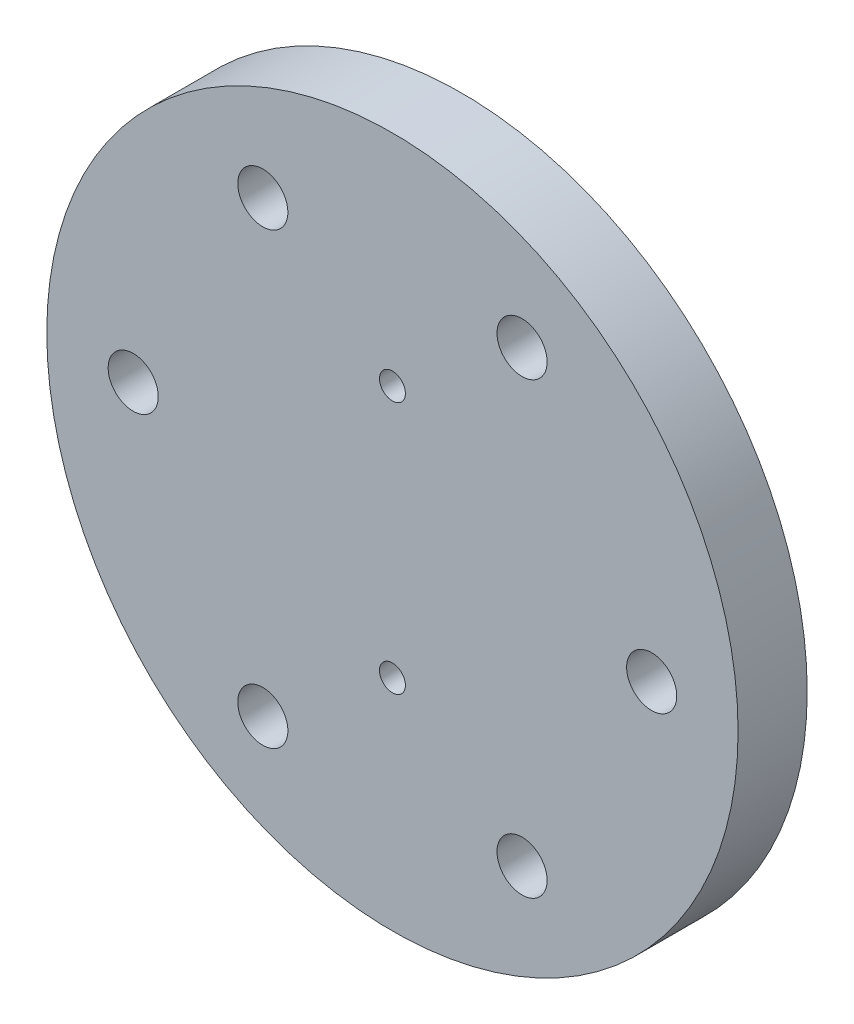
ISO-10303-21;
HEADER;
FILE_DESCRIPTION(('STEP AP214'),'2;1');
FILE_NAME('part.step','',(''),(''),'','','');
FILE_SCHEMA(('AUTOMOTIVE_DESIGN { 1 0 10303 214 1 1 1 1 }'));
ENDSEC;
DATA;
#1=APPLICATION_CONTEXT('core data for automotive mechanical design processes');
#2=APPLICATION_PROTOCOL_DEFINITION('international standard','automotive_design',2000,#1);
#3=PRODUCT_CONTEXT('',#1,'mechanical');
#4=PRODUCT('Part','Part','',(#3));
#5=PRODUCT_RELATED_PRODUCT_CATEGORY('part','',(#4));
#6=PRODUCT_DEFINITION_FORMATION('','',#4);
#7=PRODUCT_DEFINITION_CONTEXT('part definition',#1,'design');
#8=PRODUCT_DEFINITION('design','',#6,#7);
#9=PRODUCT_DEFINITION_SHAPE('','',#8);
#10=(LENGTH_UNIT() NAMED_UNIT(*) SI_UNIT(.MILLI.,.METRE.));
#11=(NAMED_UNIT(*) PLANE_ANGLE_UNIT() SI_UNIT($,.RADIAN.));
#12=(NAMED_UNIT(*) SI_UNIT($,.STERADIAN.) SOLID_ANGLE_UNIT());
#13=UNCERTAINTY_MEASURE_WITH_UNIT(LENGTH_MEASURE(1.E-05),#10,'distance_accuracy_value','');
#14=(GEOMETRIC_REPRESENTATION_CONTEXT(3) GLOBAL_UNCERTAINTY_ASSIGNED_CONTEXT((#13)) GLOBAL_UNIT_ASSIGNED_CONTEXT((#10,
#11,#12)) REPRESENTATION_CONTEXT('',''));
#15=CARTESIAN_POINT('',(0.,0.,0.));
#16=DIRECTION('',(0.,0.,1.));
#17=DIRECTION('',(1.,0.,0.));
#18=AXIS2_PLACEMENT_3D('',#15,#16,#17);
#19=CARTESIAN_POINT('',(0.,0.,8.));
#20=DIRECTION('',(0.,0.,-1.));
#21=DIRECTION('',(-1.,0.,0.));
#22=AXIS2_PLACEMENT_3D('',#19,#20,#21);
#23=PLANE('',#22);
#24=CARTESIAN_POINT('',(-60.0000000000006,14.6254466051496,8.));
#25=DIRECTION('',(0.,0.,-1.));
#26=DIRECTION('',(-1.,0.,0.));
#27=AXIS2_PLACEMENT_3D('',#24,#25,#26);
#28=CIRCLE('',#27,1.50000000000008);
#29=CARTESIAN_POINT('',(-61.5000000000007,14.6254466051496,8.));
#30=VERTEX_POINT('',#29);
#31=EDGE_CURVE('E82',#30,#30,#28,.T.);
#32=ORIENTED_EDGE('',*,*,#31,.T.);
#33=EDGE_LOOP('',(#32));
#34=FACE_BOUND('',#33,.T.);
#35=CARTESIAN_POINT('',(-60.0000000000006,-14.6245541914156,8.));
#36=DIRECTION('',(0.,0.,-1.));
#37=DIRECTION('',(-1.,0.,0.));
#38=AXIS2_PLACEMENT_3D('',#35,#36,#37);
#39=CIRCLE('',#38,1.50000000000008);
#40=CARTESIAN_POINT('',(-61.5000000000007,-14.6245541914156,8.));
#41=VERTEX_POINT('',#40);
#42=EDGE_CURVE('E85',#41,#41,#39,.T.);
#43=ORIENTED_EDGE('',*,*,#42,.T.);
#44=EDGE_LOOP('',(#43));
#45=FACE_BOUND('',#44,.T.);
#46=CARTESIAN_POINT('',(-74.9999999999989,25.9807621135329,8.));
#47=DIRECTION('',(0.,0.,-1.));
#48=DIRECTION('',(-1.,0.,0.));
#49=AXIS2_PLACEMENT_3D('',#46,#47,#48);
#50=CIRCLE('',#49,2.89999999999999);
#51=CARTESIAN_POINT('',(-77.8999999999989,25.9807621135329,8.));
#52=VERTEX_POINT('',#51);
#53=EDGE_CURVE('E76',#52,#52,#50,.T.);
#54=ORIENTED_EDGE('',*,*,#53,.T.);
#55=EDGE_LOOP('',(#54));
#56=FACE_BOUND('',#55,.T.);
#57=CARTESIAN_POINT('',(-44.9999999999988,25.9807621135322,8.));
#58=DIRECTION('',(0.,0.,-1.));
#59=DIRECTION('',(-1.,0.,0.));
#60=AXIS2_PLACEMENT_3D('',#57,#58,#59);
#61=CIRCLE('',#60,2.89999999999999);
#62=CARTESIAN_POINT('',(-47.8999999999987,25.9807621135322,8.));
#63=VERTEX_POINT('',#62);
#64=EDGE_CURVE('E70',#63,#63,#61,.T.);
#65=ORIENTED_EDGE('',*,*,#64,.T.);
#66=EDGE_LOOP('',(#65));
#67=FACE_BOUND('',#66,.T.);
#68=CARTESIAN_POINT('',(-29.9999999999994,-1.2784765609918E-12,8.));
#69=DIRECTION('',(0.,0.,-1.));
#70=DIRECTION('',(-1.,0.,0.));
#71=AXIS2_PLACEMENT_3D('',#68,#69,#70);
#72=CIRCLE('',#71,2.89999999999999);
#73=CARTESIAN_POINT('',(-32.8999999999994,-1.2784765609918E-12,8.));
#74=VERTEX_POINT('',#73);
#75=EDGE_CURVE('E64',#74,#74,#72,.T.);
#76=ORIENTED_EDGE('',*,*,#75,.T.);
#77=EDGE_LOOP('',(#76));
#78=FACE_BOUND('',#77,.T.);
#79=CARTESIAN_POINT('',(-45.,-25.9807621135342,8.));
#80=DIRECTION('',(0.,0.,-1.));
#81=DIRECTION('',(-1.,0.,0.));
#82=AXIS2_PLACEMENT_3D('',#79,#80,#81);
#83=CIRCLE('',#82,2.89999999999999);
#84=CARTESIAN_POINT('',(-47.9,-25.9807621135342,8.));
#85=VERTEX_POINT('',#84);
#86=EDGE_CURVE('E58',#85,#85,#83,.T.);
#87=ORIENTED_EDGE('',*,*,#86,.T.);
#88=EDGE_LOOP('',(#87));
#89=FACE_BOUND('',#88,.T.);
#90=CARTESIAN_POINT('',(-75.0000000000001,-25.9807621135335,8.));
#91=DIRECTION('',(0.,0.,-1.));
#92=DIRECTION('',(-1.,0.,0.));
#93=AXIS2_PLACEMENT_3D('',#90,#91,#92);
#94=CIRCLE('',#93,2.89999999999999);
#95=CARTESIAN_POINT('',(-77.9000000000001,-25.9807621135335,8.));
#96=VERTEX_POINT('',#95);
#97=EDGE_CURVE('E52',#96,#96,#94,.T.);
#98=ORIENTED_EDGE('',*,*,#97,.T.);
#99=EDGE_LOOP('',(#98));
#100=FACE_BOUND('',#99,.T.);
#101=CARTESIAN_POINT('',(-89.9999999999995,0.,8.));
#102=DIRECTION('',(0.,0.,-1.));
#103=DIRECTION('',(-1.,0.,0.));
#104=AXIS2_PLACEMENT_3D('',#101,#102,#103);
#105=CIRCLE('',#104,2.89999999999999);
#106=CARTESIAN_POINT('',(-92.8999999999995,0.,8.));
#107=VERTEX_POINT('',#106);
#108=EDGE_CURVE('E45',#107,#107,#105,.T.);
#109=ORIENTED_EDGE('',*,*,#108,.T.);
#110=EDGE_LOOP('',(#109));
#111=FACE_BOUND('',#110,.T.);
#112=CARTESIAN_POINT('',(-60.,0.,8.));
#113=DIRECTION('',(0.,0.,-1.));
#114=DIRECTION('',(-1.,0.,0.));
#115=AXIS2_PLACEMENT_3D('',#112,#113,#114);
#116=CIRCLE('',#115,40.);
#117=CARTESIAN_POINT('',(-100.,0.,8.));
#118=VERTEX_POINT('',#117);
#119=EDGE_CURVE('E10',#118,#118,#116,.T.);
#120=ORIENTED_EDGE('',*,*,#119,.F.);
#121=EDGE_LOOP('',(#120));
#122=FACE_BOUND('',#121,.T.);
#123=ADVANCED_FACE('F34',(#34,#45,#56,#67,#78,#89,#100,#111,#122),#23,.F.);
#124=CARTESIAN_POINT('',(0.,0.,0.));
#125=DIRECTION('',(0.,0.,-1.));
#126=DIRECTION('',(-1.,0.,0.));
#127=AXIS2_PLACEMENT_3D('',#124,#125,#126);
#128=PLANE('',#127);
#129=CARTESIAN_POINT('',(-60.0000000000006,14.6254466051496,3.33066907387547E-13));
#130=DIRECTION('',(0.,0.,-1.));
#131=DIRECTION('',(-1.,0.,0.));
#132=AXIS2_PLACEMENT_3D('',#129,#130,#131);
#133=CIRCLE('',#132,1.50000000000008);
#134=CARTESIAN_POINT('',(-61.5000000000007,14.6254466051496,3.33066907387547E-13));
#135=VERTEX_POINT('',#134);
#136=EDGE_CURVE('E88',#135,#135,#133,.T.);
#137=ORIENTED_EDGE('',*,*,#136,.F.);
#138=EDGE_LOOP('',(#137));
#139=FACE_BOUND('',#138,.T.);
#140=CARTESIAN_POINT('',(-60.0000000000006,-14.6245541914156,3.33066907387547E-13));
#141=DIRECTION('',(0.,0.,-1.));
#142=DIRECTION('',(-1.,0.,0.));
#143=AXIS2_PLACEMENT_3D('',#140,#141,#142);
#144=CIRCLE('',#143,1.50000000000008);
#145=CARTESIAN_POINT('',(-61.5000000000007,-14.6245541914156,3.33066907387547E-13));
#146=VERTEX_POINT('',#145);
#147=EDGE_CURVE('E89',#146,#146,#144,.T.);
#148=ORIENTED_EDGE('',*,*,#147,.F.);
#149=EDGE_LOOP('',(#148));
#150=FACE_BOUND('',#149,.T.);
#151=CARTESIAN_POINT('',(-74.9999999999989,25.9807621135329,0.));
#152=DIRECTION('',(0.,0.,-1.));
#153=DIRECTION('',(-1.,0.,0.));
#154=AXIS2_PLACEMENT_3D('',#151,#152,#153);
#155=CIRCLE('',#154,2.89999999999999);
#156=CARTESIAN_POINT('',(-77.8999999999989,25.9807621135329,0.));
#157=VERTEX_POINT('',#156);
#158=EDGE_CURVE('E79',#157,#157,#155,.T.);
#159=ORIENTED_EDGE('',*,*,#158,.F.);
#160=EDGE_LOOP('',(#159));
#161=FACE_BOUND('',#160,.T.);
#162=CARTESIAN_POINT('',(-44.9999999999988,25.9807621135322,0.));
#163=DIRECTION('',(0.,0.,-1.));
#164=DIRECTION('',(-1.,0.,0.));
#165=AXIS2_PLACEMENT_3D('',#162,#163,#164);
#166=CIRCLE('',#165,2.89999999999999);
#167=CARTESIAN_POINT('',(-47.8999999999987,25.9807621135322,0.));
#168=VERTEX_POINT('',#167);
#169=EDGE_CURVE('E73',#168,#168,#166,.T.);
#170=ORIENTED_EDGE('',*,*,#169,.F.);
#171=EDGE_LOOP('',(#170));
#172=FACE_BOUND('',#171,.T.);
#173=CARTESIAN_POINT('',(-29.9999999999994,-1.2784765609918E-12,0.));
#174=DIRECTION('',(0.,0.,-1.));
#175=DIRECTION('',(-1.,0.,0.));
#176=AXIS2_PLACEMENT_3D('',#173,#174,#175);
#177=CIRCLE('',#176,2.89999999999999);
#178=CARTESIAN_POINT('',(-32.8999999999994,-1.2784765609918E-12,0.));
#179=VERTEX_POINT('',#178);
#180=EDGE_CURVE('E67',#179,#179,#177,.T.);
#181=ORIENTED_EDGE('',*,*,#180,.F.);
#182=EDGE_LOOP('',(#181));
#183=FACE_BOUND('',#182,.T.);
#184=CARTESIAN_POINT('',(-45.,-25.9807621135342,0.));
#185=DIRECTION('',(0.,0.,-1.));
#186=DIRECTION('',(-1.,0.,0.));
#187=AXIS2_PLACEMENT_3D('',#184,#185,#186);
#188=CIRCLE('',#187,2.89999999999999);
#189=CARTESIAN_POINT('',(-47.9,-25.9807621135342,0.));
#190=VERTEX_POINT('',#189);
#191=EDGE_CURVE('E61',#190,#190,#188,.T.);
#192=ORIENTED_EDGE('',*,*,#191,.F.);
#193=EDGE_LOOP('',(#192));
#194=FACE_BOUND('',#193,.T.);
#195=CARTESIAN_POINT('',(-75.0000000000001,-25.9807621135335,0.));
#196=DIRECTION('',(0.,0.,-1.));
#197=DIRECTION('',(-1.,0.,0.));
#198=AXIS2_PLACEMENT_3D('',#195,#196,#197);
#199=CIRCLE('',#198,2.89999999999999);
#200=CARTESIAN_POINT('',(-77.9000000000001,-25.9807621135335,0.));
#201=VERTEX_POINT('',#200);
#202=EDGE_CURVE('E55',#201,#201,#199,.T.);
#203=ORIENTED_EDGE('',*,*,#202,.F.);
#204=EDGE_LOOP('',(#203));
#205=FACE_BOUND('',#204,.T.);
#206=CARTESIAN_POINT('',(-89.9999999999995,0.,0.));
#207=DIRECTION('',(0.,0.,-1.));
#208=DIRECTION('',(-1.,0.,0.));
#209=AXIS2_PLACEMENT_3D('',#206,#207,#208);
#210=CIRCLE('',#209,2.89999999999999);
#211=CARTESIAN_POINT('',(-92.8999999999995,0.,0.));
#212=VERTEX_POINT('',#211);
#213=EDGE_CURVE('E49',#212,#212,#210,.T.);
#214=ORIENTED_EDGE('',*,*,#213,.F.);
#215=EDGE_LOOP('',(#214));
#216=FACE_BOUND('',#215,.T.);
#217=CARTESIAN_POINT('',(-60.,0.,0.));
#218=DIRECTION('',(0.,0.,-1.));
#219=DIRECTION('',(-1.,0.,0.));
#220=AXIS2_PLACEMENT_3D('',#217,#218,#219);
#221=CIRCLE('',#220,40.);
#222=CARTESIAN_POINT('',(-100.,0.,0.));
#223=VERTEX_POINT('',#222);
#224=EDGE_CURVE('E38',#223,#223,#221,.T.);
#225=ORIENTED_EDGE('',*,*,#224,.T.);
#226=EDGE_LOOP('',(#225));
#227=FACE_BOUND('',#226,.T.);
#228=ADVANCED_FACE('F98',(#139,#150,#161,#172,#183,#194,#205,#216,#227),#128,.T.);
#229=CARTESIAN_POINT('',(-60.,0.,8.));
#230=DIRECTION('',(0.,0.,-1.));
#231=DIRECTION('',(-1.,0.,0.));
#232=AXIS2_PLACEMENT_3D('',#229,#230,#231);
#233=CYLINDRICAL_SURFACE('',#232,40.);
#234=ORIENTED_EDGE('',*,*,#224,.F.);
#235=EDGE_LOOP('',(#234));
#236=FACE_BOUND('',#235,.T.);
#237=ORIENTED_EDGE('',*,*,#119,.T.);
#238=EDGE_LOOP('',(#237));
#239=FACE_BOUND('',#238,.T.);
#240=ADVANCED_FACE('F36',(#236,#239),#233,.T.);
#241=CARTESIAN_POINT('',(-89.9999999999995,0.,0.));
#242=DIRECTION('',(0.,0.,-1.));
#243=DIRECTION('',(-1.,0.,0.));
#244=AXIS2_PLACEMENT_3D('',#241,#242,#243);
#245=CYLINDRICAL_SURFACE('',#244,2.89999999999999);
#246=ORIENTED_EDGE('',*,*,#213,.T.);
#247=EDGE_LOOP('',(#246));
#248=FACE_BOUND('',#247,.T.);
#249=ORIENTED_EDGE('',*,*,#108,.F.);
#250=EDGE_LOOP('',(#249));
#251=FACE_BOUND('',#250,.T.);
#252=ADVANCED_FACE('F118',(#248,#251),#245,.F.);
#253=CARTESIAN_POINT('',(-75.0000000000001,-25.9807621135335,0.));
#254=DIRECTION('',(0.,0.,-1.));
#255=DIRECTION('',(-1.,0.,0.));
#256=AXIS2_PLACEMENT_3D('',#253,#254,#255);
#257=CYLINDRICAL_SURFACE('',#256,2.89999999999999);
#258=ORIENTED_EDGE('',*,*,#202,.T.);
#259=EDGE_LOOP('',(#258));
#260=FACE_BOUND('',#259,.T.);
#261=ORIENTED_EDGE('',*,*,#97,.F.);
#262=EDGE_LOOP('',(#261));
#263=FACE_BOUND('',#262,.T.);
#264=ADVANCED_FACE('F123',(#260,#263),#257,.F.);
#265=CARTESIAN_POINT('',(-45.,-25.9807621135342,0.));
#266=DIRECTION('',(0.,0.,-1.));
#267=DIRECTION('',(-1.,0.,0.));
#268=AXIS2_PLACEMENT_3D('',#265,#266,#267);
#269=CYLINDRICAL_SURFACE('',#268,2.89999999999999);
#270=ORIENTED_EDGE('',*,*,#191,.T.);
#271=EDGE_LOOP('',(#270));
#272=FACE_BOUND('',#271,.T.);
#273=ORIENTED_EDGE('',*,*,#86,.F.);
#274=EDGE_LOOP('',(#273));
#275=FACE_BOUND('',#274,.T.);
#276=ADVANCED_FACE('F136',(#272,#275),#269,.F.);
#277=CARTESIAN_POINT('',(-29.9999999999994,-1.2784765609918E-12,0.));
#278=DIRECTION('',(0.,0.,-1.));
#279=DIRECTION('',(-1.,0.,0.));
#280=AXIS2_PLACEMENT_3D('',#277,#278,#279);
#281=CYLINDRICAL_SURFACE('',#280,2.89999999999999);
#282=ORIENTED_EDGE('',*,*,#180,.T.);
#283=EDGE_LOOP('',(#282));
#284=FACE_BOUND('',#283,.T.);
#285=ORIENTED_EDGE('',*,*,#75,.F.);
#286=EDGE_LOOP('',(#285));
#287=FACE_BOUND('',#286,.T.);
#288=ADVANCED_FACE('F140',(#284,#287),#281,.F.);
#289=CARTESIAN_POINT('',(-44.9999999999988,25.9807621135322,0.));
#290=DIRECTION('',(0.,0.,-1.));
#291=DIRECTION('',(-1.,0.,0.));
#292=AXIS2_PLACEMENT_3D('',#289,#290,#291);
#293=CYLINDRICAL_SURFACE('',#292,2.89999999999999);
#294=ORIENTED_EDGE('',*,*,#169,.T.);
#295=EDGE_LOOP('',(#294));
#296=FACE_BOUND('',#295,.T.);
#297=ORIENTED_EDGE('',*,*,#64,.F.);
#298=EDGE_LOOP('',(#297));
#299=FACE_BOUND('',#298,.T.);
#300=ADVANCED_FACE('F144',(#296,#299),#293,.F.);
#301=CARTESIAN_POINT('',(-74.9999999999989,25.9807621135329,0.));
#302=DIRECTION('',(0.,0.,-1.));
#303=DIRECTION('',(-1.,0.,0.));
#304=AXIS2_PLACEMENT_3D('',#301,#302,#303);
#305=CYLINDRICAL_SURFACE('',#304,2.89999999999999);
#306=ORIENTED_EDGE('',*,*,#158,.T.);
#307=EDGE_LOOP('',(#306));
#308=FACE_BOUND('',#307,.T.);
#309=ORIENTED_EDGE('',*,*,#53,.F.);
#310=EDGE_LOOP('',(#309));
#311=FACE_BOUND('',#310,.T.);
#312=ADVANCED_FACE('F148',(#308,#311),#305,.F.);
#313=CARTESIAN_POINT('',(-60.0000000000006,-14.6245541914156,10.0000000000003));
#314=DIRECTION('',(0.,0.,-1.));
#315=DIRECTION('',(-1.,0.,0.));
#316=AXIS2_PLACEMENT_3D('',#313,#314,#315);
#317=CYLINDRICAL_SURFACE('',#316,1.50000000000008);
#318=ORIENTED_EDGE('',*,*,#147,.T.);
#319=EDGE_LOOP('',(#318));
#320=FACE_BOUND('',#319,.T.);
#321=ORIENTED_EDGE('',*,*,#42,.F.);
#322=EDGE_LOOP('',(#321));
#323=FACE_BOUND('',#322,.T.);
#324=ADVANCED_FACE('F152',(#320,#323),#317,.F.);
#325=CARTESIAN_POINT('',(-60.0000000000006,14.6254466051496,10.0000000000003));
#326=DIRECTION('',(0.,0.,-1.));
#327=DIRECTION('',(-1.,0.,0.));
#328=AXIS2_PLACEMENT_3D('',#325,#326,#327);
#329=CYLINDRICAL_SURFACE('',#328,1.50000000000008);
#330=ORIENTED_EDGE('',*,*,#136,.T.);
#331=EDGE_LOOP('',(#330));
#332=FACE_BOUND('',#331,.T.);
#333=ORIENTED_EDGE('',*,*,#31,.F.);
#334=EDGE_LOOP('',(#333));
#335=FACE_BOUND('',#334,.T.);
#336=ADVANCED_FACE('F95',(#332,#335),#329,.F.);
#337=CLOSED_SHELL('',(#123,#228,#240,#252,#264,#276,#288,#300,#312,#324,#336));
#338=MANIFOLD_SOLID_BREP('B2',#337);
#339=ADVANCED_BREP_SHAPE_REPRESENTATION('',(#18,#338),#14);
#340=SHAPE_DEFINITION_REPRESENTATION(#9,#339);
ENDSEC;
END-ISO-10303-21;
